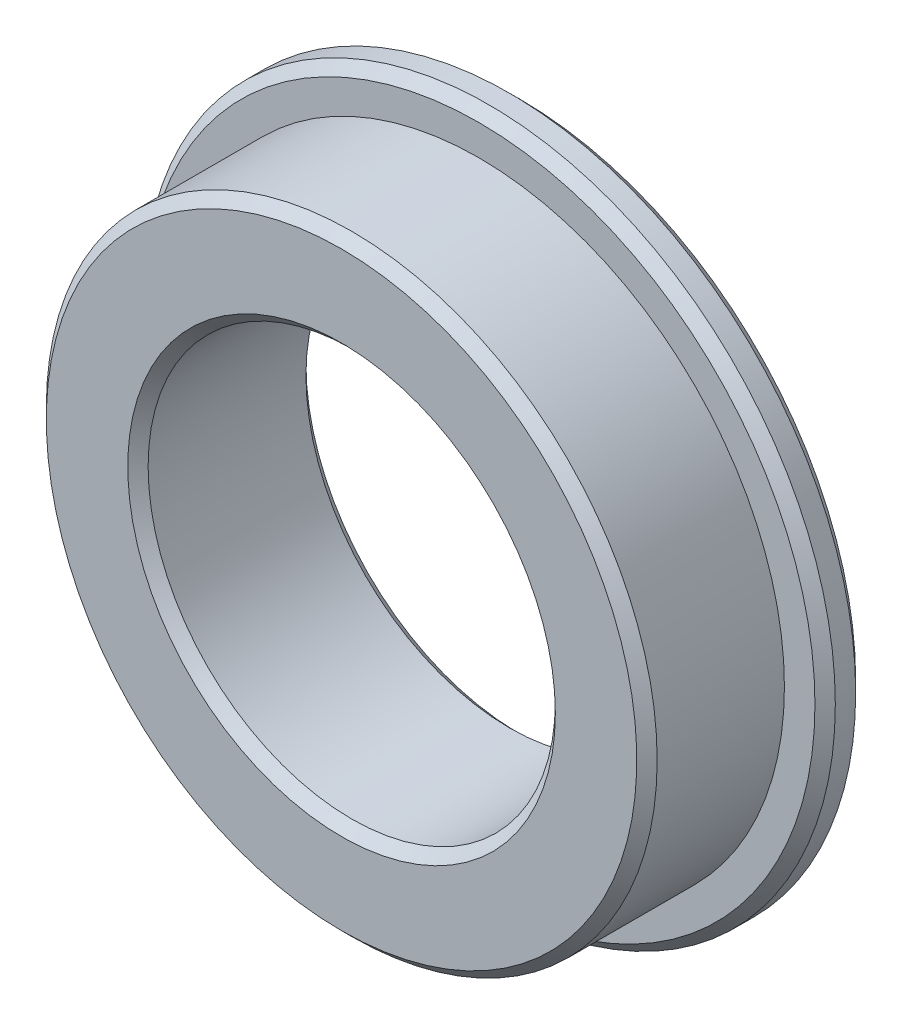
ISO-10303-21;
HEADER;
FILE_DESCRIPTION(('STEP AP214'),'2;1');
FILE_NAME('part.step','',(''),(''),'','','');
FILE_SCHEMA(('AUTOMOTIVE_DESIGN { 1 0 10303 214 1 1 1 1 }'));
ENDSEC;
DATA;
#1=APPLICATION_CONTEXT('core data for automotive mechanical design processes');
#2=APPLICATION_PROTOCOL_DEFINITION('international standard','automotive_design',2000,#1);
#3=PRODUCT_CONTEXT('',#1,'mechanical');
#4=PRODUCT('Part','Part','',(#3));
#5=PRODUCT_RELATED_PRODUCT_CATEGORY('part','',(#4));
#6=PRODUCT_DEFINITION_FORMATION('','',#4);
#7=PRODUCT_DEFINITION_CONTEXT('part definition',#1,'design');
#8=PRODUCT_DEFINITION('design','',#6,#7);
#9=PRODUCT_DEFINITION_SHAPE('','',#8);
#10=(LENGTH_UNIT() NAMED_UNIT(*) SI_UNIT(.MILLI.,.METRE.));
#11=(NAMED_UNIT(*) PLANE_ANGLE_UNIT() SI_UNIT($,.RADIAN.));
#12=(NAMED_UNIT(*) SI_UNIT($,.STERADIAN.) SOLID_ANGLE_UNIT());
#13=UNCERTAINTY_MEASURE_WITH_UNIT(LENGTH_MEASURE(1.E-05),#10,'distance_accuracy_value','');
#14=(GEOMETRIC_REPRESENTATION_CONTEXT(3) GLOBAL_UNCERTAINTY_ASSIGNED_CONTEXT((#13)) GLOBAL_UNIT_ASSIGNED_CONTEXT((#10,
#11,#12)) REPRESENTATION_CONTEXT('',''));
#15=CARTESIAN_POINT('',(0.,0.,0.));
#16=DIRECTION('',(0.,0.,1.));
#17=DIRECTION('',(1.,0.,0.));
#18=AXIS2_PLACEMENT_3D('',#15,#16,#17);
#19=CARTESIAN_POINT('',(0.,0.,1.13686837721616E-10));
#20=DIRECTION('',(0.,0.,-1.));
#21=DIRECTION('',(-1.,0.,0.));
#22=AXIS2_PLACEMENT_3D('',#19,#20,#21);
#23=CONICAL_SURFACE('',#22,4.19999999985521,0.785398163397448);
#24=CARTESIAN_POINT('',(0.,0.,0.));
#25=DIRECTION('',(0.,0.,-1.));
#26=DIRECTION('',(-1.,0.,0.));
#27=AXIS2_PLACEMENT_3D('',#24,#25,#26);
#28=CIRCLE('',#27,4.1999999999689);
#29=CARTESIAN_POINT('',(-4.1999999999689,0.,0.));
#30=VERTEX_POINT('',#29);
#31=EDGE_CURVE('E18',#30,#30,#28,.T.);
#32=ORIENTED_EDGE('',*,*,#31,.T.);
#33=EDGE_LOOP('',(#32));
#34=FACE_BOUND('',#33,.T.);
#35=CARTESIAN_POINT('',(0.,0.,0.2));
#36=DIRECTION('',(0.,0.,1.));
#37=DIRECTION('',(1.,0.,0.));
#38=AXIS2_PLACEMENT_3D('',#35,#36,#37);
#39=CIRCLE('',#38,4.);
#40=CARTESIAN_POINT('',(4.,0.,0.2));
#41=VERTEX_POINT('',#40);
#42=EDGE_CURVE('E44',#41,#41,#39,.T.);
#43=ORIENTED_EDGE('',*,*,#42,.T.);
#44=EDGE_LOOP('',(#43));
#45=FACE_BOUND('',#44,.T.);
#46=ADVANCED_FACE('F15',(#34,#45),#23,.F.);
#47=CARTESIAN_POINT('',(0.,0.,0.));
#48=DIRECTION('',(0.,0.,1.));
#49=DIRECTION('',(1.,0.,0.));
#50=AXIS2_PLACEMENT_3D('',#47,#48,#49);
#51=PLANE('',#50);
#52=ORIENTED_EDGE('',*,*,#31,.F.);
#53=EDGE_LOOP('',(#52));
#54=FACE_BOUND('',#53,.T.);
#55=CARTESIAN_POINT('',(0.,0.,-1.1368686482667E-10));
#56=DIRECTION('',(0.,0.,1.));
#57=DIRECTION('',(0.,-1.,0.));
#58=AXIS2_PLACEMENT_3D('',#55,#56,#57);
#59=CIRCLE('',#58,6.59999999999172);
#60=CARTESIAN_POINT('',(0.,-6.59999999999172,-1.13686851672747E-10));
#61=VERTEX_POINT('',#60);
#62=EDGE_CURVE('E42',#61,#61,#59,.T.);
#63=ORIENTED_EDGE('',*,*,#62,.F.);
#64=EDGE_LOOP('',(#63));
#65=FACE_BOUND('',#64,.T.);
#66=ADVANCED_FACE('F73',(#54,#65),#51,.F.);
#67=CARTESIAN_POINT('',(0.,0.,0.));
#68=DIRECTION('',(0.,0.,1.));
#69=DIRECTION('',(1.,0.,0.));
#70=AXIS2_PLACEMENT_3D('',#67,#68,#69);
#71=CYLINDRICAL_SURFACE('',#70,4.);
#72=ORIENTED_EDGE('',*,*,#42,.F.);
#73=EDGE_LOOP('',(#72));
#74=FACE_BOUND('',#73,.T.);
#75=CARTESIAN_POINT('',(0.,0.,3.30000000002428));
#76=DIRECTION('',(0.,0.,1.));
#77=DIRECTION('',(1.,0.,0.));
#78=AXIS2_PLACEMENT_3D('',#75,#76,#77);
#79=CIRCLE('',#78,3.99999999996226);
#80=CARTESIAN_POINT('',(3.99999999996226,0.,3.30000000002428));
#81=VERTEX_POINT('',#80);
#82=EDGE_CURVE('E31',#81,#81,#79,.T.);
#83=ORIENTED_EDGE('',*,*,#82,.T.);
#84=EDGE_LOOP('',(#83));
#85=FACE_BOUND('',#84,.T.);
#86=ADVANCED_FACE('F64',(#74,#85),#71,.F.);
#87=CARTESIAN_POINT('',(0.,0.,0.199999999949796));
#88=DIRECTION('',(0.,0.,1.));
#89=DIRECTION('',(0.,-1.,0.));
#90=AXIS2_PLACEMENT_3D('',#87,#88,#89);
#91=CONICAL_SURFACE('',#90,6.80000000005521,0.785398163397448);
#92=ORIENTED_EDGE('',*,*,#62,.T.);
#93=EDGE_LOOP('',(#92));
#94=FACE_BOUND('',#93,.T.);
#95=CARTESIAN_POINT('',(0.,0.,0.2));
#96=DIRECTION('',(0.,0.,1.));
#97=DIRECTION('',(1.,0.,0.));
#98=AXIS2_PLACEMENT_3D('',#95,#96,#97);
#99=CIRCLE('',#98,6.8);
#100=CARTESIAN_POINT('',(6.8,0.,0.2));
#101=VERTEX_POINT('',#100);
#102=EDGE_CURVE('E41',#101,#101,#99,.T.);
#103=ORIENTED_EDGE('',*,*,#102,.F.);
#104=EDGE_LOOP('',(#103));
#105=FACE_BOUND('',#104,.T.);
#106=ADVANCED_FACE('F61',(#94,#105),#91,.T.);
#107=CARTESIAN_POINT('',(0.,0.,3.50000000008777));
#108=DIRECTION('',(0.,0.,1.));
#109=DIRECTION('',(1.,0.,0.));
#110=AXIS2_PLACEMENT_3D('',#107,#108,#109);
#111=CONICAL_SURFACE('',#110,4.20000000002574,0.785398163397448);
#112=ORIENTED_EDGE('',*,*,#82,.F.);
#113=EDGE_LOOP('',(#112));
#114=FACE_BOUND('',#113,.T.);
#115=CARTESIAN_POINT('',(0.,0.,3.50000000008777));
#116=DIRECTION('',(0.,0.,1.));
#117=DIRECTION('',(1.,0.,0.));
#118=AXIS2_PLACEMENT_3D('',#115,#116,#117);
#119=CIRCLE('',#118,4.20000000002574);
#120=CARTESIAN_POINT('',(4.20000000002574,0.,3.50000000008777));
#121=VERTEX_POINT('',#120);
#122=EDGE_CURVE('E39',#121,#121,#119,.F.);
#123=ORIENTED_EDGE('',*,*,#122,.F.);
#124=EDGE_LOOP('',(#123));
#125=FACE_BOUND('',#124,.T.);
#126=ADVANCED_FACE('F63',(#114,#125),#111,.F.);
#127=CARTESIAN_POINT('',(0.,0.,0.));
#128=DIRECTION('',(0.,0.,1.));
#129=DIRECTION('',(1.,0.,0.));
#130=AXIS2_PLACEMENT_3D('',#127,#128,#129);
#131=CYLINDRICAL_SURFACE('',#130,6.8);
#132=ORIENTED_EDGE('',*,*,#102,.T.);
#133=EDGE_LOOP('',(#132));
#134=FACE_BOUND('',#133,.T.);
#135=CARTESIAN_POINT('',(0.,0.,0.600000000019918));
#136=DIRECTION('',(0.,0.,-1.));
#137=DIRECTION('',(1.,0.,0.));
#138=AXIS2_PLACEMENT_3D('',#135,#136,#137);
#139=CIRCLE('',#138,6.80000000005521);
#140=CARTESIAN_POINT('',(6.80000000005521,0.,0.600000000019918));
#141=VERTEX_POINT('',#140);
#142=EDGE_CURVE('E38',#141,#141,#139,.F.);
#143=ORIENTED_EDGE('',*,*,#142,.F.);
#144=EDGE_LOOP('',(#143));
#145=FACE_BOUND('',#144,.T.);
#146=ADVANCED_FACE('F58',(#134,#145),#131,.T.);
#147=CARTESIAN_POINT('',(0.,0.,3.5));
#148=DIRECTION('',(0.,0.,1.));
#149=DIRECTION('',(1.,0.,0.));
#150=AXIS2_PLACEMENT_3D('',#147,#148,#149);
#151=PLANE('',#150);
#152=ORIENTED_EDGE('',*,*,#122,.T.);
#153=EDGE_LOOP('',(#152));
#154=FACE_BOUND('',#153,.T.);
#155=CARTESIAN_POINT('',(0.,0.,3.50000000003092));
#156=DIRECTION('',(0.,0.,-1.));
#157=DIRECTION('',(0.,1.,0.));
#158=AXIS2_PLACEMENT_3D('',#155,#156,#157);
#159=CIRCLE('',#158,5.80000000002201);
#160=CARTESIAN_POINT('',(0.,5.80000000002201,3.50000000003092));
#161=VERTEX_POINT('',#160);
#162=EDGE_CURVE('E35',#161,#161,#159,.T.);
#163=ORIENTED_EDGE('',*,*,#162,.F.);
#164=EDGE_LOOP('',(#163));
#165=FACE_BOUND('',#164,.T.);
#166=ADVANCED_FACE('F94',(#154,#165),#151,.T.);
#167=CARTESIAN_POINT('',(0.,0.,0.600000000019918));
#168=DIRECTION('',(0.,0.,-1.));
#169=DIRECTION('',(-1.,0.,0.));
#170=AXIS2_PLACEMENT_3D('',#167,#168,#169);
#171=CONICAL_SURFACE('',#170,6.80000000005521,0.785398163397448);
#172=ORIENTED_EDGE('',*,*,#142,.T.);
#173=EDGE_LOOP('',(#172));
#174=FACE_BOUND('',#173,.T.);
#175=CARTESIAN_POINT('',(0.,0.,0.799999999969714));
#176=DIRECTION('',(0.,0.,-1.));
#177=DIRECTION('',(-1.,0.,0.));
#178=AXIS2_PLACEMENT_3D('',#175,#176,#177);
#179=CIRCLE('',#178,6.60000000010541);
#180=CARTESIAN_POINT('',(-6.60000000010541,0.,0.799999999969714));
#181=VERTEX_POINT('',#180);
#182=EDGE_CURVE('E27',#181,#181,#179,.F.);
#183=ORIENTED_EDGE('',*,*,#182,.F.);
#184=EDGE_LOOP('',(#183));
#185=FACE_BOUND('',#184,.T.);
#186=ADVANCED_FACE('F90',(#174,#185),#171,.T.);
#187=CARTESIAN_POINT('',(0.,0.,3.30000000013797));
#188=DIRECTION('',(0.,0.,-1.));
#189=DIRECTION('',(0.,1.,0.));
#190=AXIS2_PLACEMENT_3D('',#187,#188,#189);
#191=CONICAL_SURFACE('',#190,5.99999999991496,0.785398163397448);
#192=CARTESIAN_POINT('',(0.,0.,3.3));
#193=DIRECTION('',(0.,0.,1.));
#194=DIRECTION('',(1.,0.,0.));
#195=AXIS2_PLACEMENT_3D('',#192,#193,#194);
#196=CIRCLE('',#195,6.);
#197=CARTESIAN_POINT('',(6.,0.,3.3));
#198=VERTEX_POINT('',#197);
#199=EDGE_CURVE('E22',#198,#198,#196,.F.);
#200=ORIENTED_EDGE('',*,*,#199,.F.);
#201=EDGE_LOOP('',(#200));
#202=FACE_BOUND('',#201,.T.);
#203=ORIENTED_EDGE('',*,*,#162,.T.);
#204=EDGE_LOOP('',(#203));
#205=FACE_BOUND('',#204,.T.);
#206=ADVANCED_FACE('F83',(#202,#205),#191,.T.);
#207=CARTESIAN_POINT('',(0.,0.,0.8));
#208=DIRECTION('',(0.,0.,1.));
#209=DIRECTION('',(1.,0.,0.));
#210=AXIS2_PLACEMENT_3D('',#207,#208,#209);
#211=PLANE('',#210);
#212=CARTESIAN_POINT('',(0.,0.,0.8));
#213=DIRECTION('',(0.,0.,1.));
#214=DIRECTION('',(1.,0.,0.));
#215=AXIS2_PLACEMENT_3D('',#212,#213,#214);
#216=CIRCLE('',#215,6.);
#217=CARTESIAN_POINT('',(6.,0.,0.8));
#218=VERTEX_POINT('',#217);
#219=EDGE_CURVE('E10',#218,#218,#216,.T.);
#220=ORIENTED_EDGE('',*,*,#219,.F.);
#221=EDGE_LOOP('',(#220));
#222=FACE_BOUND('',#221,.T.);
#223=ORIENTED_EDGE('',*,*,#182,.T.);
#224=EDGE_LOOP('',(#223));
#225=FACE_BOUND('',#224,.T.);
#226=ADVANCED_FACE('F78',(#222,#225),#211,.T.);
#227=CARTESIAN_POINT('',(0.,0.,0.));
#228=DIRECTION('',(0.,0.,1.));
#229=DIRECTION('',(1.,0.,0.));
#230=AXIS2_PLACEMENT_3D('',#227,#228,#229);
#231=CYLINDRICAL_SURFACE('',#230,6.);
#232=ORIENTED_EDGE('',*,*,#219,.T.);
#233=EDGE_LOOP('',(#232));
#234=FACE_BOUND('',#233,.T.);
#235=ORIENTED_EDGE('',*,*,#199,.T.);
#236=EDGE_LOOP('',(#235));
#237=FACE_BOUND('',#236,.T.);
#238=ADVANCED_FACE('F76',(#234,#237),#231,.T.);
#239=CLOSED_SHELL('',(#46,#66,#86,#106,#126,#146,#166,#186,#206,#226,#238));
#240=MANIFOLD_SOLID_BREP('B1',#239);
#241=ADVANCED_BREP_SHAPE_REPRESENTATION('',(#18,#240),#14);
#242=SHAPE_DEFINITION_REPRESENTATION(#9,#241);
ENDSEC;
END-ISO-10303-21;
